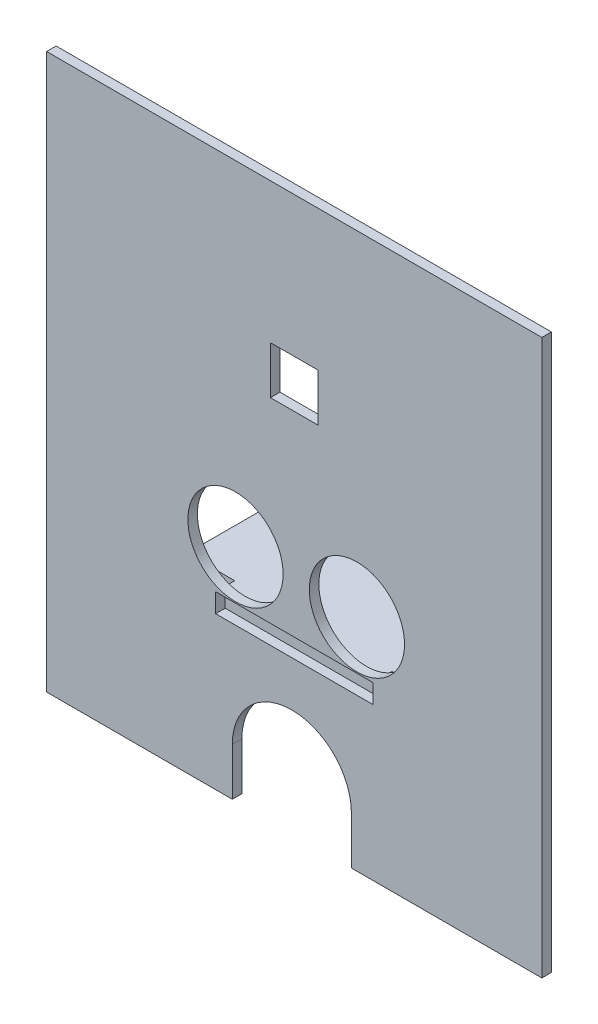
ISO-10303-21;
HEADER;
FILE_DESCRIPTION(('STEP AP214'),'2;1');
FILE_NAME('part.step','',(''),(''),'','','');
FILE_SCHEMA(('AUTOMOTIVE_DESIGN { 1 0 10303 214 1 1 1 1 }'));
ENDSEC;
DATA;
#1=APPLICATION_CONTEXT('core data for automotive mechanical design processes');
#2=APPLICATION_PROTOCOL_DEFINITION('international standard','automotive_design',2000,#1);
#3=PRODUCT_CONTEXT('',#1,'mechanical');
#4=PRODUCT('Part','Part','',(#3));
#5=PRODUCT_RELATED_PRODUCT_CATEGORY('part','',(#4));
#6=PRODUCT_DEFINITION_FORMATION('','',#4);
#7=PRODUCT_DEFINITION_CONTEXT('part definition',#1,'design');
#8=PRODUCT_DEFINITION('design','',#6,#7);
#9=PRODUCT_DEFINITION_SHAPE('','',#8);
#10=(LENGTH_UNIT() NAMED_UNIT(*) SI_UNIT(.MILLI.,.METRE.));
#11=(NAMED_UNIT(*) PLANE_ANGLE_UNIT() SI_UNIT($,.RADIAN.));
#12=(NAMED_UNIT(*) SI_UNIT($,.STERADIAN.) SOLID_ANGLE_UNIT());
#13=UNCERTAINTY_MEASURE_WITH_UNIT(LENGTH_MEASURE(1.E-05),#10,'distance_accuracy_value','');
#14=(GEOMETRIC_REPRESENTATION_CONTEXT(3) GLOBAL_UNCERTAINTY_ASSIGNED_CONTEXT((#13)) GLOBAL_UNIT_ASSIGNED_CONTEXT((#10,
#11,#12)) REPRESENTATION_CONTEXT('',''));
#15=CARTESIAN_POINT('',(0.,0.,0.));
#16=DIRECTION('',(0.,0.,1.));
#17=DIRECTION('',(1.,0.,0.));
#18=AXIS2_PLACEMENT_3D('',#15,#16,#17);
#19=CARTESIAN_POINT('',(0.,0.,2.));
#20=DIRECTION('',(0.,0.,-1.));
#21=DIRECTION('',(-1.,0.,0.));
#22=AXIS2_PLACEMENT_3D('',#19,#20,#21);
#23=PLANE('',#22);
#24=CARTESIAN_POINT('',(-0.499999999999973,15.0000000000013,2.));
#25=DIRECTION('',(0.,0.,1.));
#26=DIRECTION('',(1.,0.,0.));
#27=AXIS2_PLACEMENT_3D('',#24,#25,#26);
#28=CIRCLE('',#27,12.5);
#29=CARTESIAN_POINT('',(12.,15.0000000000013,2.));
#30=VERTEX_POINT('',#29);
#31=CARTESIAN_POINT('',(-13.,15.0000000000013,2.));
#32=VERTEX_POINT('',#31);
#33=EDGE_CURVE('E270',#30,#32,#28,.T.);
#34=ORIENTED_EDGE('',*,*,#33,.F.);
#35=DIRECTION('',(0.,1.,0.));
#36=VECTOR('',#35,1.);
#37=CARTESIAN_POINT('',(12.,15.0000000000013,2.));
#38=LINE('',#37,#36);
#39=CARTESIAN_POINT('',(12.,5.,2.));
#40=VERTEX_POINT('',#39);
#41=EDGE_CURVE('E286',#40,#30,#38,.T.);
#42=ORIENTED_EDGE('',*,*,#41,.F.);
#43=DIRECTION('',(1.,0.,0.));
#44=VECTOR('',#43,1.);
#45=CARTESIAN_POINT('',(-52.0000000000001,5.,2.));
#46=LINE('',#45,#44);
#47=CARTESIAN_POINT('',(51.9999999999999,5.,2.));
#48=VERTEX_POINT('',#47);
#49=EDGE_CURVE('E308',#40,#48,#46,.T.);
#50=ORIENTED_EDGE('',*,*,#49,.T.);
#51=DIRECTION('',(0.,1.,0.));
#52=VECTOR('',#51,1.);
#53=CARTESIAN_POINT('',(51.9999999999999,5.,2.));
#54=LINE('',#53,#52);
#55=CARTESIAN_POINT('',(51.9999999999999,121.5,2.));
#56=VERTEX_POINT('',#55);
#57=EDGE_CURVE('E314',#48,#56,#54,.T.);
#58=ORIENTED_EDGE('',*,*,#57,.T.);
#59=DIRECTION('',(-1.,0.,0.));
#60=VECTOR('',#59,1.);
#61=CARTESIAN_POINT('',(-52.0000000000001,121.5,2.));
#62=LINE('',#61,#60);
#63=CARTESIAN_POINT('',(-52.0000000000001,121.5,2.));
#64=VERTEX_POINT('',#63);
#65=EDGE_CURVE('E317',#56,#64,#62,.T.);
#66=ORIENTED_EDGE('',*,*,#65,.T.);
#67=DIRECTION('',(0.,-1.,0.));
#68=VECTOR('',#67,1.);
#69=CARTESIAN_POINT('',(-52.0000000000001,5.,2.));
#70=LINE('',#69,#68);
#71=CARTESIAN_POINT('',(-52.0000000000001,5.,2.));
#72=VERTEX_POINT('',#71);
#73=EDGE_CURVE('E304',#64,#72,#70,.T.);
#74=ORIENTED_EDGE('',*,*,#73,.T.);
#75=CARTESIAN_POINT('',(-13.,5.,2.));
#76=VERTEX_POINT('',#75);
#77=EDGE_CURVE('E310',#72,#76,#46,.T.);
#78=ORIENTED_EDGE('',*,*,#77,.T.);
#79=DIRECTION('',(0.,-1.,0.));
#80=VECTOR('',#79,1.);
#81=CARTESIAN_POINT('',(-13.,15.0000000000013,2.));
#82=LINE('',#81,#80);
#83=EDGE_CURVE('E283',#32,#76,#82,.T.);
#84=ORIENTED_EDGE('',*,*,#83,.F.);
#85=EDGE_LOOP('',(#34,#42,#50,#58,#66,#74,#78,#84));
#86=FACE_BOUND('',#85,.T.);
#87=DIRECTION('',(1.,0.,0.));
#88=VECTOR('',#87,1.);
#89=CARTESIAN_POINT('',(-16.4981669849044,37.,2.));
#90=LINE('',#89,#88);
#91=CARTESIAN_POINT('',(-16.4981669849044,37.,2.));
#92=VERTEX_POINT('',#91);
#93=CARTESIAN_POINT('',(16.5018330150956,37.,2.));
#94=VERTEX_POINT('',#93);
#95=EDGE_CURVE('E256',#92,#94,#90,.T.);
#96=ORIENTED_EDGE('',*,*,#95,.F.);
#97=DIRECTION('',(0.,-1.,0.));
#98=VECTOR('',#97,1.);
#99=CARTESIAN_POINT('',(-16.4981669849044,41.,2.));
#100=LINE('',#99,#98);
#101=CARTESIAN_POINT('',(-16.4981669849044,41.,2.));
#102=VERTEX_POINT('',#101);
#103=EDGE_CURVE('E224',#102,#92,#100,.T.);
#104=ORIENTED_EDGE('',*,*,#103,.F.);
#105=DIRECTION('',(-1.,0.,0.));
#106=VECTOR('',#105,1.);
#107=CARTESIAN_POINT('',(-16.4981669849044,41.,2.));
#108=LINE('',#107,#106);
#109=CARTESIAN_POINT('',(16.5018330150956,41.,2.));
#110=VERTEX_POINT('',#109);
#111=EDGE_CURVE('E241',#110,#102,#108,.T.);
#112=ORIENTED_EDGE('',*,*,#111,.F.);
#113=DIRECTION('',(0.,1.,0.));
#114=VECTOR('',#113,1.);
#115=CARTESIAN_POINT('',(16.5018330150956,41.,2.));
#116=LINE('',#115,#114);
#117=EDGE_CURVE('E260',#94,#110,#116,.T.);
#118=ORIENTED_EDGE('',*,*,#117,.F.);
#119=EDGE_LOOP('',(#96,#104,#112,#118));
#120=FACE_BOUND('',#119,.T.);
#121=CARTESIAN_POINT('',(13.1599999999974,51.2500000000001,2.));
#122=DIRECTION('',(0.,0.,1.));
#123=DIRECTION('',(1.,0.,0.));
#124=AXIS2_PLACEMENT_3D('',#121,#122,#123);
#125=CIRCLE('',#124,10.);
#126=CARTESIAN_POINT('',(23.1599999999974,51.2500000000001,2.));
#127=VERTEX_POINT('',#126);
#128=EDGE_CURVE('E229',#127,#127,#125,.T.);
#129=ORIENTED_EDGE('',*,*,#128,.F.);
#130=EDGE_LOOP('',(#129));
#131=FACE_BOUND('',#130,.T.);
#132=CARTESIAN_POINT('',(-12.3400000000026,51.2499999999999,2.));
#133=DIRECTION('',(0.,0.,1.));
#134=DIRECTION('',(1.,0.,0.));
#135=AXIS2_PLACEMENT_3D('',#132,#133,#134);
#136=CIRCLE('',#135,10.);
#137=CARTESIAN_POINT('',(-2.34000000000257,51.2499999999999,2.));
#138=VERTEX_POINT('',#137);
#139=EDGE_CURVE('E225',#138,#138,#136,.T.);
#140=ORIENTED_EDGE('',*,*,#139,.F.);
#141=EDGE_LOOP('',(#140));
#142=FACE_BOUND('',#141,.T.);
#143=DIRECTION('',(0.,-1.,0.));
#144=VECTOR('',#143,1.);
#145=CARTESIAN_POINT('',(-5.00000000000008,0.,2.));
#146=LINE('',#145,#144);
#147=CARTESIAN_POINT('',(-5.00000000000008,92.05,2.));
#148=VERTEX_POINT('',#147);
#149=CARTESIAN_POINT('',(-5.00000000000008,82.05,2.));
#150=VERTEX_POINT('',#149);
#151=EDGE_CURVE('E175',#148,#150,#146,.T.);
#152=ORIENTED_EDGE('',*,*,#151,.F.);
#153=DIRECTION('',(1.,0.,0.));
#154=VECTOR('',#153,1.);
#155=CARTESIAN_POINT('',(0.,92.05,2.));
#156=LINE('',#155,#154);
#157=CARTESIAN_POINT('',(4.99999999999992,92.05,2.));
#158=VERTEX_POINT('',#157);
#159=EDGE_CURVE('E185',#148,#158,#156,.T.);
#160=ORIENTED_EDGE('',*,*,#159,.T.);
#161=DIRECTION('',(0.,-1.,0.));
#162=VECTOR('',#161,1.);
#163=CARTESIAN_POINT('',(4.99999999999993,0.,2.));
#164=LINE('',#163,#162);
#165=CARTESIAN_POINT('',(4.99999999999992,82.05,2.));
#166=VERTEX_POINT('',#165);
#167=EDGE_CURVE('E75',#158,#166,#164,.T.);
#168=ORIENTED_EDGE('',*,*,#167,.T.);
#169=DIRECTION('',(1.,0.,0.));
#170=VECTOR('',#169,1.);
#171=CARTESIAN_POINT('',(0.,82.05,2.));
#172=LINE('',#171,#170);
#173=EDGE_CURVE('E182',#150,#166,#172,.T.);
#174=ORIENTED_EDGE('',*,*,#173,.F.);
#175=EDGE_LOOP('',(#152,#160,#168,#174));
#176=FACE_BOUND('',#175,.T.);
#177=ADVANCED_FACE('F59',(#86,#120,#131,#142,#176),#23,.F.);
#178=CARTESIAN_POINT('',(0.,0.,0.));
#179=DIRECTION('',(0.,0.,-1.));
#180=DIRECTION('',(-1.,0.,0.));
#181=AXIS2_PLACEMENT_3D('',#178,#179,#180);
#182=PLANE('',#181);
#183=CARTESIAN_POINT('',(-12.3400000000026,51.2499999999999,0.));
#184=DIRECTION('',(0.,0.,1.));
#185=DIRECTION('',(1.,0.,0.));
#186=AXIS2_PLACEMENT_3D('',#183,#184,#185);
#187=CIRCLE('',#186,10.);
#188=CARTESIAN_POINT('',(-2.34000000000257,51.2499999999999,0.));
#189=VERTEX_POINT('',#188);
#190=EDGE_CURVE('E220',#189,#189,#187,.T.);
#191=ORIENTED_EDGE('',*,*,#190,.T.);
#192=EDGE_LOOP('',(#191));
#193=FACE_BOUND('',#192,.T.);
#194=CARTESIAN_POINT('',(13.1599999999974,51.2500000000001,0.));
#195=DIRECTION('',(0.,0.,1.));
#196=DIRECTION('',(1.,0.,0.));
#197=AXIS2_PLACEMENT_3D('',#194,#195,#196);
#198=CIRCLE('',#197,10.);
#199=CARTESIAN_POINT('',(23.1599999999974,51.2500000000001,0.));
#200=VERTEX_POINT('',#199);
#201=EDGE_CURVE('E214',#200,#200,#198,.T.);
#202=ORIENTED_EDGE('',*,*,#201,.T.);
#203=EDGE_LOOP('',(#202));
#204=FACE_BOUND('',#203,.T.);
#205=DIRECTION('',(0.,-1.,0.));
#206=VECTOR('',#205,1.);
#207=CARTESIAN_POINT('',(-16.4981669849044,41.,0.));
#208=LINE('',#207,#206);
#209=CARTESIAN_POINT('',(-16.4981669849044,41.,0.));
#210=VERTEX_POINT('',#209);
#211=CARTESIAN_POINT('',(-16.4981669849044,37.,0.));
#212=VERTEX_POINT('',#211);
#213=EDGE_CURVE('E236',#210,#212,#208,.T.);
#214=ORIENTED_EDGE('',*,*,#213,.T.);
#215=DIRECTION('',(1.,0.,0.));
#216=VECTOR('',#215,1.);
#217=CARTESIAN_POINT('',(-16.4981669849044,37.,0.));
#218=LINE('',#217,#216);
#219=CARTESIAN_POINT('',(16.5018330150956,37.,0.));
#220=VERTEX_POINT('',#219);
#221=EDGE_CURVE('E240',#212,#220,#218,.T.);
#222=ORIENTED_EDGE('',*,*,#221,.T.);
#223=DIRECTION('',(0.,1.,0.));
#224=VECTOR('',#223,1.);
#225=CARTESIAN_POINT('',(16.5018330150956,41.,0.));
#226=LINE('',#225,#224);
#227=CARTESIAN_POINT('',(16.5018330150956,41.,0.));
#228=VERTEX_POINT('',#227);
#229=EDGE_CURVE('E245',#220,#228,#226,.T.);
#230=ORIENTED_EDGE('',*,*,#229,.T.);
#231=DIRECTION('',(-1.,0.,0.));
#232=VECTOR('',#231,1.);
#233=CARTESIAN_POINT('',(-16.4981669849044,41.,0.));
#234=LINE('',#233,#232);
#235=EDGE_CURVE('E249',#228,#210,#234,.T.);
#236=ORIENTED_EDGE('',*,*,#235,.T.);
#237=EDGE_LOOP('',(#214,#222,#230,#236));
#238=FACE_BOUND('',#237,.T.);
#239=DIRECTION('',(0.,-1.,0.));
#240=VECTOR('',#239,1.);
#241=CARTESIAN_POINT('',(12.,0.,0.));
#242=LINE('',#241,#240);
#243=CARTESIAN_POINT('',(12.,15.0000000000013,0.));
#244=VERTEX_POINT('',#243);
#245=CARTESIAN_POINT('',(12.,5.,0.));
#246=VERTEX_POINT('',#245);
#247=EDGE_CURVE('E12',#244,#246,#242,.T.);
#248=ORIENTED_EDGE('',*,*,#247,.F.);
#249=CARTESIAN_POINT('',(-0.499999999999973,15.0000000000013,0.));
#250=DIRECTION('',(0.,0.,-1.));
#251=DIRECTION('',(-1.,0.,0.));
#252=AXIS2_PLACEMENT_3D('',#249,#250,#251);
#253=CIRCLE('',#252,12.5);
#254=CARTESIAN_POINT('',(-13.,15.0000000000013,0.));
#255=VERTEX_POINT('',#254);
#256=EDGE_CURVE('E68',#255,#244,#253,.T.);
#257=ORIENTED_EDGE('',*,*,#256,.F.);
#258=DIRECTION('',(0.,1.,0.));
#259=VECTOR('',#258,1.);
#260=CARTESIAN_POINT('',(-13.,0.,0.));
#261=LINE('',#260,#259);
#262=CARTESIAN_POINT('',(-13.,5.,0.));
#263=VERTEX_POINT('',#262);
#264=EDGE_CURVE('E349',#263,#255,#261,.T.);
#265=ORIENTED_EDGE('',*,*,#264,.F.);
#266=DIRECTION('',(1.,0.,0.));
#267=VECTOR('',#266,1.);
#268=CARTESIAN_POINT('',(-52.0000000000001,5.,0.));
#269=LINE('',#268,#267);
#270=CARTESIAN_POINT('',(-52.0000000000001,5.,0.));
#271=VERTEX_POINT('',#270);
#272=EDGE_CURVE('E325',#271,#263,#269,.T.);
#273=ORIENTED_EDGE('',*,*,#272,.F.);
#274=DIRECTION('',(0.,-1.,0.));
#275=VECTOR('',#274,1.);
#276=CARTESIAN_POINT('',(-52.0000000000001,5.,0.));
#277=LINE('',#276,#275);
#278=CARTESIAN_POINT('',(-52.0000000000001,121.5,0.));
#279=VERTEX_POINT('',#278);
#280=EDGE_CURVE('E294',#279,#271,#277,.T.);
#281=ORIENTED_EDGE('',*,*,#280,.F.);
#282=DIRECTION('',(-1.,0.,0.));
#283=VECTOR('',#282,1.);
#284=CARTESIAN_POINT('',(-52.0000000000001,121.5,0.));
#285=LINE('',#284,#283);
#286=CARTESIAN_POINT('',(51.9999999999999,121.5,0.));
#287=VERTEX_POINT('',#286);
#288=EDGE_CURVE('E309',#287,#279,#285,.T.);
#289=ORIENTED_EDGE('',*,*,#288,.F.);
#290=DIRECTION('',(0.,1.,0.));
#291=VECTOR('',#290,1.);
#292=CARTESIAN_POINT('',(51.9999999999999,5.,0.));
#293=LINE('',#292,#291);
#294=CARTESIAN_POINT('',(51.9999999999999,5.,0.));
#295=VERTEX_POINT('',#294);
#296=EDGE_CURVE('E329',#295,#287,#293,.T.);
#297=ORIENTED_EDGE('',*,*,#296,.F.);
#298=EDGE_CURVE('E324',#246,#295,#269,.T.);
#299=ORIENTED_EDGE('',*,*,#298,.F.);
#300=EDGE_LOOP('',(#248,#257,#265,#273,#281,#289,#297,#299));
#301=FACE_BOUND('',#300,.T.);
#302=DIRECTION('',(1.,0.,0.));
#303=VECTOR('',#302,1.);
#304=CARTESIAN_POINT('',(0.,92.05,0.));
#305=LINE('',#304,#303);
#306=CARTESIAN_POINT('',(-5.00000000000008,92.05,0.));
#307=VERTEX_POINT('',#306);
#308=CARTESIAN_POINT('',(4.99999999999992,92.05,0.));
#309=VERTEX_POINT('',#308);
#310=EDGE_CURVE('E205',#307,#309,#305,.T.);
#311=ORIENTED_EDGE('',*,*,#310,.F.);
#312=DIRECTION('',(0.,-1.,0.));
#313=VECTOR('',#312,1.);
#314=CARTESIAN_POINT('',(-5.00000000000008,0.,0.));
#315=LINE('',#314,#313);
#316=CARTESIAN_POINT('',(-5.00000000000008,82.05,0.));
#317=VERTEX_POINT('',#316);
#318=EDGE_CURVE('E83',#307,#317,#315,.T.);
#319=ORIENTED_EDGE('',*,*,#318,.T.);
#320=DIRECTION('',(1.,0.,0.));
#321=VECTOR('',#320,1.);
#322=CARTESIAN_POINT('',(0.,82.05,0.));
#323=LINE('',#322,#321);
#324=CARTESIAN_POINT('',(4.99999999999992,82.05,0.));
#325=VERTEX_POINT('',#324);
#326=EDGE_CURVE('E192',#317,#325,#323,.T.);
#327=ORIENTED_EDGE('',*,*,#326,.T.);
#328=DIRECTION('',(0.,-1.,0.));
#329=VECTOR('',#328,1.);
#330=CARTESIAN_POINT('',(4.99999999999993,0.,0.));
#331=LINE('',#330,#329);
#332=EDGE_CURVE('E196',#309,#325,#331,.T.);
#333=ORIENTED_EDGE('',*,*,#332,.F.);
#334=EDGE_LOOP('',(#311,#319,#327,#333));
#335=FACE_BOUND('',#334,.T.);
#336=ADVANCED_FACE('F366',(#193,#204,#238,#301,#335),#182,.T.);
#337=CARTESIAN_POINT('',(-52.0000000000001,5.,2.));
#338=DIRECTION('',(0.,1.,0.));
#339=DIRECTION('',(0.,0.,1.));
#340=AXIS2_PLACEMENT_3D('',#337,#338,#339);
#341=PLANE('',#340);
#342=ORIENTED_EDGE('',*,*,#49,.F.);
#343=DIRECTION('',(0.,0.,1.));
#344=VECTOR('',#343,1.);
#345=CARTESIAN_POINT('',(12.,5.,-2.));
#346=LINE('',#345,#344);
#347=EDGE_CURVE('E295',#246,#40,#346,.T.);
#348=ORIENTED_EDGE('',*,*,#347,.F.);
#349=ORIENTED_EDGE('',*,*,#298,.T.);
#350=DIRECTION('',(0.,0.,-1.));
#351=VECTOR('',#350,1.);
#352=CARTESIAN_POINT('',(51.9999999999999,5.,2.));
#353=LINE('',#352,#351);
#354=EDGE_CURVE('E341',#48,#295,#353,.T.);
#355=ORIENTED_EDGE('',*,*,#354,.F.);
#356=EDGE_LOOP('',(#342,#348,#349,#355));
#357=FACE_BOUND('',#356,.T.);
#358=ADVANCED_FACE('F379',(#357),#341,.F.);
#359=CARTESIAN_POINT('',(-52.0000000000001,5.,2.));
#360=DIRECTION('',(1.,0.,0.));
#361=DIRECTION('',(0.,0.,-1.));
#362=AXIS2_PLACEMENT_3D('',#359,#360,#361);
#363=PLANE('',#362);
#364=ORIENTED_EDGE('',*,*,#280,.T.);
#365=DIRECTION('',(0.,0.,-1.));
#366=VECTOR('',#365,1.);
#367=CARTESIAN_POINT('',(-52.0000000000001,5.,2.));
#368=LINE('',#367,#366);
#369=EDGE_CURVE('E345',#72,#271,#368,.T.);
#370=ORIENTED_EDGE('',*,*,#369,.F.);
#371=ORIENTED_EDGE('',*,*,#73,.F.);
#372=DIRECTION('',(0.,0.,-1.));
#373=VECTOR('',#372,1.);
#374=CARTESIAN_POINT('',(-52.0000000000001,121.5,2.));
#375=LINE('',#374,#373);
#376=EDGE_CURVE('E320',#64,#279,#375,.T.);
#377=ORIENTED_EDGE('',*,*,#376,.T.);
#378=EDGE_LOOP('',(#364,#370,#371,#377));
#379=FACE_BOUND('',#378,.T.);
#380=ADVANCED_FACE('F61',(#379),#363,.F.);
#381=ORIENTED_EDGE('',*,*,#272,.T.);
#382=DIRECTION('',(0.,0.,1.));
#383=VECTOR('',#382,1.);
#384=CARTESIAN_POINT('',(-13.,5.,-2.));
#385=LINE('',#384,#383);
#386=EDGE_CURVE('E298',#263,#76,#385,.T.);
#387=ORIENTED_EDGE('',*,*,#386,.T.);
#388=ORIENTED_EDGE('',*,*,#77,.F.);
#389=ORIENTED_EDGE('',*,*,#369,.T.);
#390=EDGE_LOOP('',(#381,#387,#388,#389));
#391=FACE_BOUND('',#390,.T.);
#392=ADVANCED_FACE('F392',(#391),#341,.F.);
#393=CARTESIAN_POINT('',(51.9999999999999,5.,2.));
#394=DIRECTION('',(-1.,0.,0.));
#395=DIRECTION('',(0.,0.,1.));
#396=AXIS2_PLACEMENT_3D('',#393,#394,#395);
#397=PLANE('',#396);
#398=ORIENTED_EDGE('',*,*,#296,.T.);
#399=DIRECTION('',(0.,0.,-1.));
#400=VECTOR('',#399,1.);
#401=CARTESIAN_POINT('',(51.9999999999999,121.5,2.));
#402=LINE('',#401,#400);
#403=EDGE_CURVE('E337',#56,#287,#402,.T.);
#404=ORIENTED_EDGE('',*,*,#403,.F.);
#405=ORIENTED_EDGE('',*,*,#57,.F.);
#406=ORIENTED_EDGE('',*,*,#354,.T.);
#407=EDGE_LOOP('',(#398,#404,#405,#406));
#408=FACE_BOUND('',#407,.T.);
#409=ADVANCED_FACE('F381',(#408),#397,.F.);
#410=CARTESIAN_POINT('',(-52.0000000000001,121.5,2.));
#411=DIRECTION('',(0.,-1.,0.));
#412=DIRECTION('',(0.,0.,-1.));
#413=AXIS2_PLACEMENT_3D('',#410,#411,#412);
#414=PLANE('',#413);
#415=ORIENTED_EDGE('',*,*,#288,.T.);
#416=ORIENTED_EDGE('',*,*,#376,.F.);
#417=ORIENTED_EDGE('',*,*,#65,.F.);
#418=ORIENTED_EDGE('',*,*,#403,.T.);
#419=EDGE_LOOP('',(#415,#416,#417,#418));
#420=FACE_BOUND('',#419,.T.);
#421=ADVANCED_FACE('F385',(#420),#414,.F.);
#422=CARTESIAN_POINT('',(-0.499999999999973,15.0000000000013,-2.));
#423=DIRECTION('',(0.,0.,1.));
#424=DIRECTION('',(1.,0.,0.));
#425=AXIS2_PLACEMENT_3D('',#422,#423,#424);
#426=CYLINDRICAL_SURFACE('',#425,12.5);
#427=ORIENTED_EDGE('',*,*,#256,.T.);
#428=DIRECTION('',(0.,0.,1.));
#429=VECTOR('',#428,1.);
#430=CARTESIAN_POINT('',(12.,15.0000000000013,-2.));
#431=LINE('',#430,#429);
#432=EDGE_CURVE('E291',#244,#30,#431,.T.);
#433=ORIENTED_EDGE('',*,*,#432,.T.);
#434=ORIENTED_EDGE('',*,*,#33,.T.);
#435=DIRECTION('',(0.,0.,1.));
#436=VECTOR('',#435,1.);
#437=CARTESIAN_POINT('',(-13.,15.0000000000013,-2.));
#438=LINE('',#437,#436);
#439=EDGE_CURVE('E290',#255,#32,#438,.T.);
#440=ORIENTED_EDGE('',*,*,#439,.F.);
#441=EDGE_LOOP('',(#427,#433,#434,#440));
#442=FACE_BOUND('',#441,.T.);
#443=ADVANCED_FACE('F356',(#442),#426,.F.);
#444=CARTESIAN_POINT('',(12.,15.0000000000013,-2.));
#445=DIRECTION('',(1.,0.,0.));
#446=DIRECTION('',(0.,1.,0.));
#447=AXIS2_PLACEMENT_3D('',#444,#445,#446);
#448=PLANE('',#447);
#449=ORIENTED_EDGE('',*,*,#247,.T.);
#450=ORIENTED_EDGE('',*,*,#347,.T.);
#451=ORIENTED_EDGE('',*,*,#41,.T.);
#452=ORIENTED_EDGE('',*,*,#432,.F.);
#453=EDGE_LOOP('',(#449,#450,#451,#452));
#454=FACE_BOUND('',#453,.T.);
#455=ADVANCED_FACE('F361',(#454),#448,.F.);
#456=CARTESIAN_POINT('',(-13.,15.0000000000013,-2.));
#457=DIRECTION('',(-1.,0.,0.));
#458=DIRECTION('',(0.,-1.,0.));
#459=AXIS2_PLACEMENT_3D('',#456,#457,#458);
#460=PLANE('',#459);
#461=ORIENTED_EDGE('',*,*,#264,.T.);
#462=ORIENTED_EDGE('',*,*,#439,.T.);
#463=ORIENTED_EDGE('',*,*,#83,.T.);
#464=ORIENTED_EDGE('',*,*,#386,.F.);
#465=EDGE_LOOP('',(#461,#462,#463,#464));
#466=FACE_BOUND('',#465,.T.);
#467=ADVANCED_FACE('F394',(#466),#460,.F.);
#468=CARTESIAN_POINT('',(-16.4981669849044,41.,0.));
#469=DIRECTION('',(-1.,0.,0.));
#470=DIRECTION('',(0.,0.,1.));
#471=AXIS2_PLACEMENT_3D('',#468,#469,#470);
#472=PLANE('',#471);
#473=ORIENTED_EDGE('',*,*,#103,.T.);
#474=DIRECTION('',(0.,0.,1.));
#475=VECTOR('',#474,1.);
#476=CARTESIAN_POINT('',(-16.4981669849044,37.,0.));
#477=LINE('',#476,#475);
#478=EDGE_CURVE('E253',#212,#92,#477,.T.);
#479=ORIENTED_EDGE('',*,*,#478,.F.);
#480=ORIENTED_EDGE('',*,*,#213,.F.);
#481=DIRECTION('',(0.,0.,1.));
#482=VECTOR('',#481,1.);
#483=CARTESIAN_POINT('',(-16.4981669849044,41.,0.));
#484=LINE('',#483,#482);
#485=EDGE_CURVE('E267',#210,#102,#484,.T.);
#486=ORIENTED_EDGE('',*,*,#485,.T.);
#487=EDGE_LOOP('',(#473,#479,#480,#486));
#488=FACE_BOUND('',#487,.T.);
#489=ADVANCED_FACE('F396',(#488),#472,.F.);
#490=CARTESIAN_POINT('',(-16.4981669849044,41.,0.));
#491=DIRECTION('',(0.,1.,0.));
#492=DIRECTION('',(0.,0.,1.));
#493=AXIS2_PLACEMENT_3D('',#490,#491,#492);
#494=PLANE('',#493);
#495=ORIENTED_EDGE('',*,*,#111,.T.);
#496=ORIENTED_EDGE('',*,*,#485,.F.);
#497=ORIENTED_EDGE('',*,*,#235,.F.);
#498=DIRECTION('',(0.,0.,1.));
#499=VECTOR('',#498,1.);
#500=CARTESIAN_POINT('',(16.5018330150956,41.,0.));
#501=LINE('',#500,#499);
#502=EDGE_CURVE('E271',#228,#110,#501,.T.);
#503=ORIENTED_EDGE('',*,*,#502,.T.);
#504=EDGE_LOOP('',(#495,#496,#497,#503));
#505=FACE_BOUND('',#504,.T.);
#506=ADVANCED_FACE('F402',(#505),#494,.F.);
#507=CARTESIAN_POINT('',(16.5018330150956,41.,0.));
#508=DIRECTION('',(1.,0.,0.));
#509=DIRECTION('',(0.,0.,-1.));
#510=AXIS2_PLACEMENT_3D('',#507,#508,#509);
#511=PLANE('',#510);
#512=ORIENTED_EDGE('',*,*,#117,.T.);
#513=ORIENTED_EDGE('',*,*,#502,.F.);
#514=ORIENTED_EDGE('',*,*,#229,.F.);
#515=DIRECTION('',(0.,0.,1.));
#516=VECTOR('',#515,1.);
#517=CARTESIAN_POINT('',(16.5018330150956,37.,0.));
#518=LINE('',#517,#516);
#519=EDGE_CURVE('E274',#220,#94,#518,.T.);
#520=ORIENTED_EDGE('',*,*,#519,.T.);
#521=EDGE_LOOP('',(#512,#513,#514,#520));
#522=FACE_BOUND('',#521,.T.);
#523=ADVANCED_FACE('F456',(#522),#511,.F.);
#524=CARTESIAN_POINT('',(-16.4981669849044,37.,0.));
#525=DIRECTION('',(0.,-1.,0.));
#526=DIRECTION('',(0.,0.,-1.));
#527=AXIS2_PLACEMENT_3D('',#524,#525,#526);
#528=PLANE('',#527);
#529=ORIENTED_EDGE('',*,*,#95,.T.);
#530=ORIENTED_EDGE('',*,*,#519,.F.);
#531=ORIENTED_EDGE('',*,*,#221,.F.);
#532=ORIENTED_EDGE('',*,*,#478,.T.);
#533=EDGE_LOOP('',(#529,#530,#531,#532));
#534=FACE_BOUND('',#533,.T.);
#535=ADVANCED_FACE('F467',(#534),#528,.F.);
#536=CARTESIAN_POINT('',(13.1599999999974,51.2500000000001,0.));
#537=DIRECTION('',(0.,0.,1.));
#538=DIRECTION('',(1.,0.,0.));
#539=AXIS2_PLACEMENT_3D('',#536,#537,#538);
#540=CYLINDRICAL_SURFACE('',#539,10.);
#541=ORIENTED_EDGE('',*,*,#201,.F.);
#542=EDGE_LOOP('',(#541));
#543=FACE_BOUND('',#542,.T.);
#544=ORIENTED_EDGE('',*,*,#128,.T.);
#545=EDGE_LOOP('',(#544));
#546=FACE_BOUND('',#545,.T.);
#547=ADVANCED_FACE('F478',(#543,#546),#540,.F.);
#548=CARTESIAN_POINT('',(-12.3400000000026,51.2499999999999,0.));
#549=DIRECTION('',(0.,0.,1.));
#550=DIRECTION('',(1.,0.,0.));
#551=AXIS2_PLACEMENT_3D('',#548,#549,#550);
#552=CYLINDRICAL_SURFACE('',#551,10.);
#553=ORIENTED_EDGE('',*,*,#190,.F.);
#554=EDGE_LOOP('',(#553));
#555=FACE_BOUND('',#554,.T.);
#556=ORIENTED_EDGE('',*,*,#139,.T.);
#557=EDGE_LOOP('',(#556));
#558=FACE_BOUND('',#557,.T.);
#559=ADVANCED_FACE('F489',(#555,#558),#552,.F.);
#560=CARTESIAN_POINT('',(-5.00000000000008,0.,2.));
#561=DIRECTION('',(1.,0.,0.));
#562=DIRECTION('',(0.,0.,-1.));
#563=AXIS2_PLACEMENT_3D('',#560,#561,#562);
#564=PLANE('',#563);
#565=ORIENTED_EDGE('',*,*,#318,.F.);
#566=DIRECTION('',(0.,0.,-1.));
#567=VECTOR('',#566,1.);
#568=CARTESIAN_POINT('',(-5.00000000000008,92.05,2.));
#569=LINE('',#568,#567);
#570=EDGE_CURVE('E171',#148,#307,#569,.T.);
#571=ORIENTED_EDGE('',*,*,#570,.F.);
#572=ORIENTED_EDGE('',*,*,#151,.T.);
#573=DIRECTION('',(0.,0.,-1.));
#574=VECTOR('',#573,1.);
#575=CARTESIAN_POINT('',(-5.00000000000008,82.05,2.));
#576=LINE('',#575,#574);
#577=EDGE_CURVE('E211',#150,#317,#576,.T.);
#578=ORIENTED_EDGE('',*,*,#577,.T.);
#579=EDGE_LOOP('',(#565,#571,#572,#578));
#580=FACE_BOUND('',#579,.T.);
#581=ADVANCED_FACE('F173',(#580),#564,.T.);
#582=CARTESIAN_POINT('',(0.,82.05,2.));
#583=DIRECTION('',(0.,1.,0.));
#584=DIRECTION('',(0.,0.,1.));
#585=AXIS2_PLACEMENT_3D('',#582,#583,#584);
#586=PLANE('',#585);
#587=ORIENTED_EDGE('',*,*,#326,.F.);
#588=ORIENTED_EDGE('',*,*,#577,.F.);
#589=ORIENTED_EDGE('',*,*,#173,.T.);
#590=DIRECTION('',(0.,0.,-1.));
#591=VECTOR('',#590,1.);
#592=CARTESIAN_POINT('',(4.99999999999992,82.05,2.));
#593=LINE('',#592,#591);
#594=EDGE_CURVE('E215',#166,#325,#593,.T.);
#595=ORIENTED_EDGE('',*,*,#594,.T.);
#596=EDGE_LOOP('',(#587,#588,#589,#595));
#597=FACE_BOUND('',#596,.T.);
#598=ADVANCED_FACE('F510',(#597),#586,.T.);
#599=CARTESIAN_POINT('',(4.99999999999993,0.,2.));
#600=DIRECTION('',(1.,0.,0.));
#601=DIRECTION('',(0.,1.,0.));
#602=AXIS2_PLACEMENT_3D('',#599,#600,#601);
#603=PLANE('',#602);
#604=ORIENTED_EDGE('',*,*,#332,.T.);
#605=ORIENTED_EDGE('',*,*,#594,.F.);
#606=ORIENTED_EDGE('',*,*,#167,.F.);
#607=DIRECTION('',(0.,0.,-1.));
#608=VECTOR('',#607,1.);
#609=CARTESIAN_POINT('',(4.99999999999992,92.05,2.));
#610=LINE('',#609,#608);
#611=EDGE_CURVE('E181',#158,#309,#610,.T.);
#612=ORIENTED_EDGE('',*,*,#611,.T.);
#613=EDGE_LOOP('',(#604,#605,#606,#612));
#614=FACE_BOUND('',#613,.T.);
#615=ADVANCED_FACE('F520',(#614),#603,.F.);
#616=CARTESIAN_POINT('',(0.,92.05,2.));
#617=DIRECTION('',(0.,1.,0.));
#618=DIRECTION('',(0.,0.,1.));
#619=AXIS2_PLACEMENT_3D('',#616,#617,#618);
#620=PLANE('',#619);
#621=ORIENTED_EDGE('',*,*,#310,.T.);
#622=ORIENTED_EDGE('',*,*,#611,.F.);
#623=ORIENTED_EDGE('',*,*,#159,.F.);
#624=ORIENTED_EDGE('',*,*,#570,.T.);
#625=EDGE_LOOP('',(#621,#622,#623,#624));
#626=FACE_BOUND('',#625,.T.);
#627=ADVANCED_FACE('F186',(#626),#620,.F.);
#628=CLOSED_SHELL('',(#177,#336,#358,#380,#392,#409,#421,#443,#455,#467,#489,#506,#523,#535,
#547,#559,#581,#598,#615,#627));
#629=MANIFOLD_SOLID_BREP('B2',#628);
#630=CARTESIAN_POINT('',(26.4999999999999,41.,-20.));
#631=DIRECTION('',(-1.,0.,0.));
#632=DIRECTION('',(0.,0.,1.));
#633=AXIS2_PLACEMENT_3D('',#630,#631,#632);
#634=PLANE('',#633);
#635=DIRECTION('',(0.,0.,1.));
#636=VECTOR('',#635,1.);
#637=CARTESIAN_POINT('',(26.4999999999999,41.,-20.));
#638=LINE('',#637,#636);
#639=CARTESIAN_POINT('',(26.4999999999999,41.,-20.));
#640=VERTEX_POINT('',#639);
#641=CARTESIAN_POINT('',(26.4999999999999,41.,-2.));
#642=VERTEX_POINT('',#641);
#643=EDGE_CURVE('E712',#640,#642,#638,.T.);
#644=ORIENTED_EDGE('',*,*,#643,.T.);
#645=DIRECTION('',(0.,1.,0.));
#646=VECTOR('',#645,1.);
#647=CARTESIAN_POINT('',(26.4999999999999,21.,-2.));
#648=LINE('',#647,#646);
#649=CARTESIAN_POINT('',(26.4999999999999,37.,-2.));
#650=VERTEX_POINT('',#649);
#651=EDGE_CURVE('E694',#650,#642,#648,.T.);
#652=ORIENTED_EDGE('',*,*,#651,.F.);
#653=DIRECTION('',(0.,0.,1.));
#654=VECTOR('',#653,1.);
#655=CARTESIAN_POINT('',(26.4999999999999,37.,-20.));
#656=LINE('',#655,#654);
#657=CARTESIAN_POINT('',(26.4999999999999,37.,-20.));
#658=VERTEX_POINT('',#657);
#659=EDGE_CURVE('E732',#658,#650,#656,.T.);
#660=ORIENTED_EDGE('',*,*,#659,.F.);
#661=DIRECTION('',(0.,-1.,0.));
#662=VECTOR('',#661,1.);
#663=CARTESIAN_POINT('',(26.4999999999999,41.,-20.));
#664=LINE('',#663,#662);
#665=EDGE_CURVE('E717',#640,#658,#664,.T.);
#666=ORIENTED_EDGE('',*,*,#665,.F.);
#667=EDGE_LOOP('',(#644,#652,#660,#666));
#668=FACE_BOUND('',#667,.T.);
#669=ADVANCED_FACE('F630',(#668),#634,.F.);
#670=CARTESIAN_POINT('',(26.4999999999999,37.,-20.));
#671=DIRECTION('',(0.,1.,0.));
#672=DIRECTION('',(-1.,0.,0.));
#673=AXIS2_PLACEMENT_3D('',#670,#671,#672);
#674=PLANE('',#673);
#675=DIRECTION('',(-1.,0.,0.));
#676=VECTOR('',#675,1.);
#677=CARTESIAN_POINT('',(26.4999999999999,37.,-2.));
#678=LINE('',#677,#676);
#679=CARTESIAN_POINT('',(16.4999999999999,37.,-2.));
#680=VERTEX_POINT('',#679);
#681=EDGE_CURVE('E700',#650,#680,#678,.T.);
#682=ORIENTED_EDGE('',*,*,#681,.T.);
#683=DIRECTION('',(0.,0.,1.));
#684=VECTOR('',#683,1.);
#685=CARTESIAN_POINT('',(16.4999999999999,37.,-20.));
#686=LINE('',#685,#684);
#687=CARTESIAN_POINT('',(16.4999999999999,37.,0.));
#688=VERTEX_POINT('',#687);
#689=EDGE_CURVE('E745',#680,#688,#686,.T.);
#690=ORIENTED_EDGE('',*,*,#689,.T.);
#691=DIRECTION('',(-1.,0.,0.));
#692=VECTOR('',#691,1.);
#693=CARTESIAN_POINT('',(26.4999999999999,37.,0.));
#694=LINE('',#693,#692);
#695=CARTESIAN_POINT('',(-16.5000000000001,37.,0.));
#696=VERTEX_POINT('',#695);
#697=EDGE_CURVE('E738',#688,#696,#694,.T.);
#698=ORIENTED_EDGE('',*,*,#697,.T.);
#699=DIRECTION('',(0.,0.,-1.));
#700=VECTOR('',#699,1.);
#701=CARTESIAN_POINT('',(-16.5000000000001,37.,-20.));
#702=LINE('',#701,#700);
#703=CARTESIAN_POINT('',(-16.5000000000001,37.,-2.));
#704=VERTEX_POINT('',#703);
#705=EDGE_CURVE('E644',#696,#704,#702,.T.);
#706=ORIENTED_EDGE('',*,*,#705,.T.);
#707=DIRECTION('',(-1.,0.,0.));
#708=VECTOR('',#707,1.);
#709=CARTESIAN_POINT('',(26.4999999999999,37.,-2.));
#710=LINE('',#709,#708);
#711=CARTESIAN_POINT('',(-26.5000000000001,37.,-2.));
#712=VERTEX_POINT('',#711);
#713=EDGE_CURVE('E746',#704,#712,#710,.T.);
#714=ORIENTED_EDGE('',*,*,#713,.T.);
#715=DIRECTION('',(0.,0.,1.));
#716=VECTOR('',#715,1.);
#717=CARTESIAN_POINT('',(-26.5000000000001,37.,-20.));
#718=LINE('',#717,#716);
#719=CARTESIAN_POINT('',(-26.5000000000001,37.,-20.));
#720=VERTEX_POINT('',#719);
#721=EDGE_CURVE('E722',#720,#712,#718,.T.);
#722=ORIENTED_EDGE('',*,*,#721,.F.);
#723=DIRECTION('',(-1.,0.,0.));
#724=VECTOR('',#723,1.);
#725=CARTESIAN_POINT('',(26.4999999999999,37.,-20.));
#726=LINE('',#725,#724);
#727=EDGE_CURVE('E750',#658,#720,#726,.T.);
#728=ORIENTED_EDGE('',*,*,#727,.F.);
#729=ORIENTED_EDGE('',*,*,#659,.T.);
#730=EDGE_LOOP('',(#682,#690,#698,#706,#714,#722,#728,#729));
#731=FACE_BOUND('',#730,.T.);
#732=ADVANCED_FACE('F743',(#731),#674,.F.);
#733=CARTESIAN_POINT('',(-26.5000000000001,41.,-20.));
#734=DIRECTION('',(1.,0.,0.));
#735=DIRECTION('',(0.,0.,-1.));
#736=AXIS2_PLACEMENT_3D('',#733,#734,#735);
#737=PLANE('',#736);
#738=ORIENTED_EDGE('',*,*,#721,.T.);
#739=DIRECTION('',(0.,1.,0.));
#740=VECTOR('',#739,1.);
#741=CARTESIAN_POINT('',(-26.5000000000001,21.,-2.));
#742=LINE('',#741,#740);
#743=CARTESIAN_POINT('',(-26.5000000000001,41.,-2.));
#744=VERTEX_POINT('',#743);
#745=EDGE_CURVE('E760',#712,#744,#742,.T.);
#746=ORIENTED_EDGE('',*,*,#745,.T.);
#747=DIRECTION('',(0.,0.,1.));
#748=VECTOR('',#747,1.);
#749=CARTESIAN_POINT('',(-26.5000000000001,41.,-20.));
#750=LINE('',#749,#748);
#751=CARTESIAN_POINT('',(-26.5000000000001,41.,-20.));
#752=VERTEX_POINT('',#751);
#753=EDGE_CURVE('E718',#752,#744,#750,.T.);
#754=ORIENTED_EDGE('',*,*,#753,.F.);
#755=DIRECTION('',(0.,1.,0.));
#756=VECTOR('',#755,1.);
#757=CARTESIAN_POINT('',(-26.5000000000001,41.,-20.));
#758=LINE('',#757,#756);
#759=EDGE_CURVE('E724',#720,#752,#758,.T.);
#760=ORIENTED_EDGE('',*,*,#759,.F.);
#761=EDGE_LOOP('',(#738,#746,#754,#760));
#762=FACE_BOUND('',#761,.T.);
#763=ADVANCED_FACE('F773',(#762),#737,.F.);
#764=CARTESIAN_POINT('',(26.4999999999999,41.,-20.));
#765=DIRECTION('',(0.,-1.,0.));
#766=DIRECTION('',(0.,0.,-1.));
#767=AXIS2_PLACEMENT_3D('',#764,#765,#766);
#768=PLANE('',#767);
#769=DIRECTION('',(1.,0.,0.));
#770=VECTOR('',#769,1.);
#771=CARTESIAN_POINT('',(26.4999999999999,41.,0.));
#772=LINE('',#771,#770);
#773=CARTESIAN_POINT('',(-16.5000000000001,41.,0.));
#774=VERTEX_POINT('',#773);
#775=CARTESIAN_POINT('',(16.4999999999999,41.,0.));
#776=VERTEX_POINT('',#775);
#777=EDGE_CURVE('E727',#774,#776,#772,.T.);
#778=ORIENTED_EDGE('',*,*,#777,.T.);
#779=DIRECTION('',(0.,0.,1.));
#780=VECTOR('',#779,1.);
#781=CARTESIAN_POINT('',(16.4999999999999,41.,-2.));
#782=LINE('',#781,#780);
#783=CARTESIAN_POINT('',(16.4999999999999,41.,-2.));
#784=VERTEX_POINT('',#783);
#785=EDGE_CURVE('E652',#784,#776,#782,.T.);
#786=ORIENTED_EDGE('',*,*,#785,.F.);
#787=DIRECTION('',(-1.,0.,0.));
#788=VECTOR('',#787,1.);
#789=CARTESIAN_POINT('',(26.4999999999999,41.,-2.));
#790=LINE('',#789,#788);
#791=EDGE_CURVE('E698',#642,#784,#790,.T.);
#792=ORIENTED_EDGE('',*,*,#791,.F.);
#793=ORIENTED_EDGE('',*,*,#643,.F.);
#794=DIRECTION('',(1.,0.,0.));
#795=VECTOR('',#794,1.);
#796=CARTESIAN_POINT('',(26.4999999999999,41.,-20.));
#797=LINE('',#796,#795);
#798=EDGE_CURVE('E719',#752,#640,#797,.T.);
#799=ORIENTED_EDGE('',*,*,#798,.F.);
#800=ORIENTED_EDGE('',*,*,#753,.T.);
#801=DIRECTION('',(-1.,0.,0.));
#802=VECTOR('',#801,1.);
#803=CARTESIAN_POINT('',(-26.5000000000001,41.,-2.));
#804=LINE('',#803,#802);
#805=CARTESIAN_POINT('',(-16.5000000000001,41.,-2.));
#806=VERTEX_POINT('',#805);
#807=EDGE_CURVE('E757',#806,#744,#804,.T.);
#808=ORIENTED_EDGE('',*,*,#807,.F.);
#809=DIRECTION('',(0.,0.,-1.));
#810=VECTOR('',#809,1.);
#811=CARTESIAN_POINT('',(-16.5000000000001,41.,0.));
#812=LINE('',#811,#810);
#813=EDGE_CURVE('E714',#774,#806,#812,.T.);
#814=ORIENTED_EDGE('',*,*,#813,.F.);
#815=EDGE_LOOP('',(#778,#786,#792,#793,#799,#800,#808,#814));
#816=FACE_BOUND('',#815,.T.);
#817=ADVANCED_FACE('F710',(#816),#768,.F.);
#818=CARTESIAN_POINT('',(0.,0.,-20.));
#819=DIRECTION('',(0.,0.,-1.));
#820=DIRECTION('',(-1.,0.,0.));
#821=AXIS2_PLACEMENT_3D('',#818,#819,#820);
#822=PLANE('',#821);
#823=ORIENTED_EDGE('',*,*,#665,.T.);
#824=ORIENTED_EDGE('',*,*,#727,.T.);
#825=ORIENTED_EDGE('',*,*,#759,.T.);
#826=ORIENTED_EDGE('',*,*,#798,.T.);
#827=EDGE_LOOP('',(#823,#824,#825,#826));
#828=FACE_BOUND('',#827,.T.);
#829=ADVANCED_FACE('F769',(#828),#822,.T.);
#830=CARTESIAN_POINT('',(0.,0.,0.));
#831=DIRECTION('',(0.,0.,-1.));
#832=DIRECTION('',(-1.,0.,0.));
#833=AXIS2_PLACEMENT_3D('',#830,#831,#832);
#834=PLANE('',#833);
#835=ORIENTED_EDGE('',*,*,#697,.F.);
#836=DIRECTION('',(0.,1.,0.));
#837=VECTOR('',#836,1.);
#838=CARTESIAN_POINT('',(16.4999999999999,0.,0.));
#839=LINE('',#838,#837);
#840=EDGE_CURVE('E57',#688,#776,#839,.T.);
#841=ORIENTED_EDGE('',*,*,#840,.T.);
#842=ORIENTED_EDGE('',*,*,#777,.F.);
#843=DIRECTION('',(0.,-1.,0.));
#844=VECTOR('',#843,1.);
#845=CARTESIAN_POINT('',(-16.5000000000001,0.,0.));
#846=LINE('',#845,#844);
#847=EDGE_CURVE('E637',#774,#696,#846,.T.);
#848=ORIENTED_EDGE('',*,*,#847,.T.);
#849=EDGE_LOOP('',(#835,#841,#842,#848));
#850=FACE_BOUND('',#849,.T.);
#851=ADVANCED_FACE('F737',(#850),#834,.F.);
#852=CARTESIAN_POINT('',(-26.5000000000001,21.,-2.));
#853=DIRECTION('',(0.,0.,-1.));
#854=DIRECTION('',(-1.,0.,0.));
#855=AXIS2_PLACEMENT_3D('',#852,#853,#854);
#856=PLANE('',#855);
#857=DIRECTION('',(0.,1.,0.));
#858=VECTOR('',#857,1.);
#859=CARTESIAN_POINT('',(-16.5000000000001,21.,-2.));
#860=LINE('',#859,#858);
#861=EDGE_CURVE('E759',#704,#806,#860,.T.);
#862=ORIENTED_EDGE('',*,*,#861,.T.);
#863=ORIENTED_EDGE('',*,*,#807,.T.);
#864=ORIENTED_EDGE('',*,*,#745,.F.);
#865=ORIENTED_EDGE('',*,*,#713,.F.);
#866=EDGE_LOOP('',(#862,#863,#864,#865));
#867=FACE_BOUND('',#866,.T.);
#868=ADVANCED_FACE('F775',(#867),#856,.F.);
#869=CARTESIAN_POINT('',(-16.5000000000001,21.,0.));
#870=DIRECTION('',(1.,0.,0.));
#871=DIRECTION('',(0.,0.,-1.));
#872=AXIS2_PLACEMENT_3D('',#869,#870,#871);
#873=PLANE('',#872);
#874=ORIENTED_EDGE('',*,*,#847,.F.);
#875=ORIENTED_EDGE('',*,*,#813,.T.);
#876=ORIENTED_EDGE('',*,*,#861,.F.);
#877=ORIENTED_EDGE('',*,*,#705,.F.);
#878=EDGE_LOOP('',(#874,#875,#876,#877));
#879=FACE_BOUND('',#878,.T.);
#880=ADVANCED_FACE('F776',(#879),#873,.F.);
#881=CARTESIAN_POINT('',(26.4999999999999,21.,-2.));
#882=DIRECTION('',(0.,0.,-1.));
#883=DIRECTION('',(-1.,0.,0.));
#884=AXIS2_PLACEMENT_3D('',#881,#882,#883);
#885=PLANE('',#884);
#886=ORIENTED_EDGE('',*,*,#651,.T.);
#887=ORIENTED_EDGE('',*,*,#791,.T.);
#888=DIRECTION('',(0.,1.,0.));
#889=VECTOR('',#888,1.);
#890=CARTESIAN_POINT('',(16.4999999999999,21.,-2.));
#891=LINE('',#890,#889);
#892=EDGE_CURVE('E705',#680,#784,#891,.T.);
#893=ORIENTED_EDGE('',*,*,#892,.F.);
#894=ORIENTED_EDGE('',*,*,#681,.F.);
#895=EDGE_LOOP('',(#886,#887,#893,#894));
#896=FACE_BOUND('',#895,.T.);
#897=ADVANCED_FACE('F696',(#896),#885,.F.);
#898=CARTESIAN_POINT('',(16.4999999999999,21.,-2.));
#899=DIRECTION('',(-1.,0.,0.));
#900=DIRECTION('',(0.,0.,1.));
#901=AXIS2_PLACEMENT_3D('',#898,#899,#900);
#902=PLANE('',#901);
#903=ORIENTED_EDGE('',*,*,#892,.T.);
#904=ORIENTED_EDGE('',*,*,#785,.T.);
#905=ORIENTED_EDGE('',*,*,#840,.F.);
#906=ORIENTED_EDGE('',*,*,#689,.F.);
#907=EDGE_LOOP('',(#903,#904,#905,#906));
#908=FACE_BOUND('',#907,.T.);
#909=ADVANCED_FACE('F765',(#908),#902,.F.);
#910=CLOSED_SHELL('',(#669,#732,#763,#817,#829,#851,#868,#880,#897,#909));
#911=MANIFOLD_SOLID_BREP('B6',#910);
#912=ADVANCED_BREP_SHAPE_REPRESENTATION('',(#18,#629,#911),#14);
#913=SHAPE_DEFINITION_REPRESENTATION(#9,#912);
ENDSEC;
END-ISO-10303-21;
